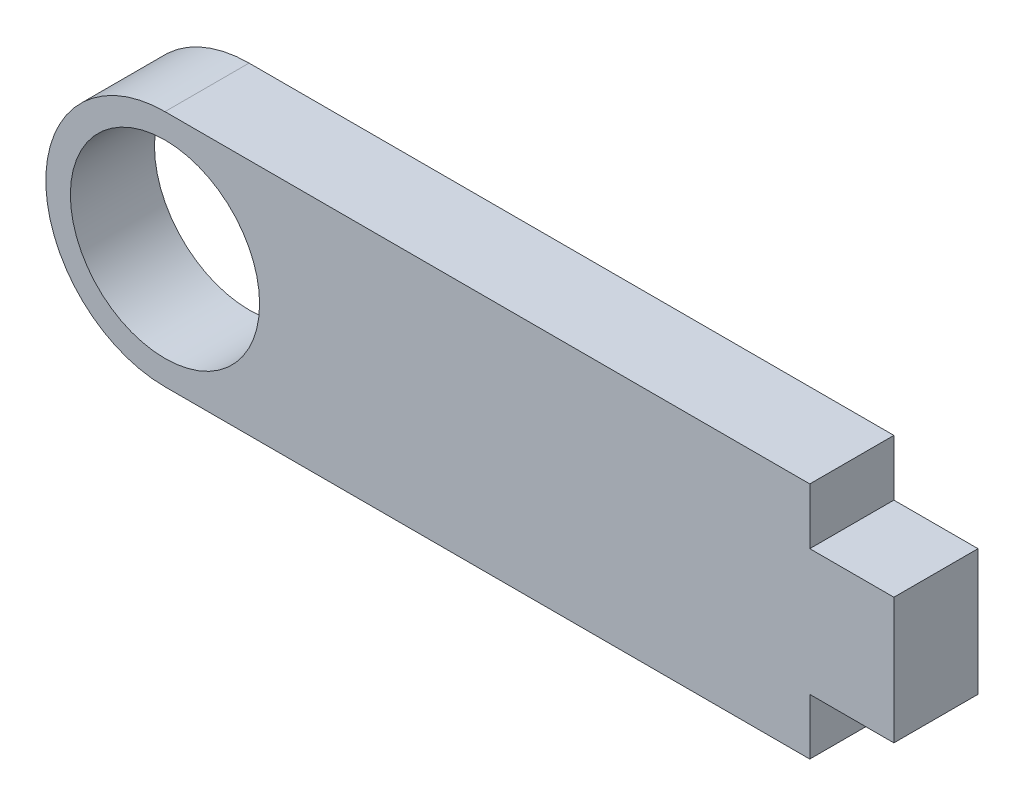
ISO-10303-21;
HEADER;
FILE_DESCRIPTION(('STEP AP214'),'2;1');
FILE_NAME('part.step','',(''),(''),'','','');
FILE_SCHEMA(('AUTOMOTIVE_DESIGN { 1 0 10303 214 1 1 1 1 }'));
ENDSEC;
DATA;
#1=APPLICATION_CONTEXT('core data for automotive mechanical design processes');
#2=APPLICATION_PROTOCOL_DEFINITION('international standard','automotive_design',2000,#1);
#3=PRODUCT_CONTEXT('',#1,'mechanical');
#4=PRODUCT('Part','Part','',(#3));
#5=PRODUCT_RELATED_PRODUCT_CATEGORY('part','',(#4));
#6=PRODUCT_DEFINITION_FORMATION('','',#4);
#7=PRODUCT_DEFINITION_CONTEXT('part definition',#1,'design');
#8=PRODUCT_DEFINITION('design','',#6,#7);
#9=PRODUCT_DEFINITION_SHAPE('','',#8);
#10=(LENGTH_UNIT() NAMED_UNIT(*) SI_UNIT(.MILLI.,.METRE.));
#11=(NAMED_UNIT(*) PLANE_ANGLE_UNIT() SI_UNIT($,.RADIAN.));
#12=(NAMED_UNIT(*) SI_UNIT($,.STERADIAN.) SOLID_ANGLE_UNIT());
#13=UNCERTAINTY_MEASURE_WITH_UNIT(LENGTH_MEASURE(1.E-05),#10,'distance_accuracy_value','');
#14=(GEOMETRIC_REPRESENTATION_CONTEXT(3) GLOBAL_UNCERTAINTY_ASSIGNED_CONTEXT((#13)) GLOBAL_UNIT_ASSIGNED_CONTEXT((#10,
#11,#12)) REPRESENTATION_CONTEXT('',''));
#15=CARTESIAN_POINT('',(0.,0.,0.));
#16=DIRECTION('',(0.,0.,1.));
#17=DIRECTION('',(1.,0.,0.));
#18=AXIS2_PLACEMENT_3D('',#15,#16,#17);
#19=CARTESIAN_POINT('',(-26.,8.5,3.));
#20=DIRECTION('',(0.,0.,1.));
#21=DIRECTION('',(1.,0.,0.));
#22=AXIS2_PLACEMENT_3D('',#19,#20,#21);
#23=PLANE('',#22);
#24=CARTESIAN_POINT('',(-26.,8.5,3.));
#25=DIRECTION('',(0.,0.,1.));
#26=DIRECTION('',(1.,0.,0.));
#27=AXIS2_PLACEMENT_3D('',#24,#25,#26);
#28=CIRCLE('',#27,4.25);
#29=CARTESIAN_POINT('',(-26.,12.75,3.));
#30=VERTEX_POINT('',#29);
#31=CARTESIAN_POINT('',(-26.,4.25,3.));
#32=VERTEX_POINT('',#31);
#33=EDGE_CURVE('E156',#30,#32,#28,.T.);
#34=ORIENTED_EDGE('',*,*,#33,.T.);
#35=DIRECTION('',(1.,0.,0.));
#36=VECTOR('',#35,1.);
#37=CARTESIAN_POINT('',(-26.,4.25,3.));
#38=LINE('',#37,#36);
#39=CARTESIAN_POINT('',(-3.,4.25,3.));
#40=VERTEX_POINT('',#39);
#41=EDGE_CURVE('E104',#32,#40,#38,.T.);
#42=ORIENTED_EDGE('',*,*,#41,.T.);
#43=DIRECTION('',(0.,1.,0.));
#44=VECTOR('',#43,1.);
#45=CARTESIAN_POINT('',(-3.,6.25,3.));
#46=LINE('',#45,#44);
#47=CARTESIAN_POINT('',(-3.,6.25,3.));
#48=VERTEX_POINT('',#47);
#49=EDGE_CURVE('E171',#40,#48,#46,.T.);
#50=ORIENTED_EDGE('',*,*,#49,.T.);
#51=DIRECTION('',(1.,0.,0.));
#52=VECTOR('',#51,1.);
#53=CARTESIAN_POINT('',(0.,6.25,3.));
#54=LINE('',#53,#52);
#55=CARTESIAN_POINT('',(0.,6.25,3.));
#56=VERTEX_POINT('',#55);
#57=EDGE_CURVE('E184',#48,#56,#54,.T.);
#58=ORIENTED_EDGE('',*,*,#57,.T.);
#59=DIRECTION('',(0.,1.,0.));
#60=VECTOR('',#59,1.);
#61=CARTESIAN_POINT('',(0.,10.75,3.));
#62=LINE('',#61,#60);
#63=CARTESIAN_POINT('',(0.,10.75,3.));
#64=VERTEX_POINT('',#63);
#65=EDGE_CURVE('E123',#56,#64,#62,.T.);
#66=ORIENTED_EDGE('',*,*,#65,.T.);
#67=DIRECTION('',(-1.,0.,0.));
#68=VECTOR('',#67,1.);
#69=CARTESIAN_POINT('',(-3.,10.75,3.));
#70=LINE('',#69,#68);
#71=CARTESIAN_POINT('',(-3.,10.75,3.));
#72=VERTEX_POINT('',#71);
#73=EDGE_CURVE('E117',#64,#72,#70,.T.);
#74=ORIENTED_EDGE('',*,*,#73,.T.);
#75=DIRECTION('',(0.,1.,0.));
#76=VECTOR('',#75,1.);
#77=CARTESIAN_POINT('',(-3.,12.75,3.));
#78=LINE('',#77,#76);
#79=CARTESIAN_POINT('',(-3.,12.75,3.));
#80=VERTEX_POINT('',#79);
#81=EDGE_CURVE('E121',#72,#80,#78,.T.);
#82=ORIENTED_EDGE('',*,*,#81,.T.);
#83=DIRECTION('',(-1.,0.,0.));
#84=VECTOR('',#83,1.);
#85=CARTESIAN_POINT('',(-26.,12.75,3.));
#86=LINE('',#85,#84);
#87=EDGE_CURVE('E61',#80,#30,#86,.T.);
#88=ORIENTED_EDGE('',*,*,#87,.T.);
#89=EDGE_LOOP('',(#34,#42,#50,#58,#66,#74,#82,#88));
#90=FACE_BOUND('',#89,.T.);
#91=CARTESIAN_POINT('',(-26.,8.5,3.));
#92=DIRECTION('',(0.,0.,1.));
#93=DIRECTION('',(1.,0.,0.));
#94=AXIS2_PLACEMENT_3D('',#91,#92,#93);
#95=CIRCLE('',#94,3.375);
#96=CARTESIAN_POINT('',(-22.625,8.5,3.));
#97=VERTEX_POINT('',#96);
#98=EDGE_CURVE('E145',#97,#97,#95,.T.);
#99=ORIENTED_EDGE('',*,*,#98,.F.);
#100=EDGE_LOOP('',(#99));
#101=FACE_BOUND('',#100,.T.);
#102=ADVANCED_FACE('F44',(#90,#101),#23,.T.);
#103=CARTESIAN_POINT('',(-26.,8.5,0.));
#104=DIRECTION('',(0.,0.,1.));
#105=DIRECTION('',(1.,0.,0.));
#106=AXIS2_PLACEMENT_3D('',#103,#104,#105);
#107=PLANE('',#106);
#108=CARTESIAN_POINT('',(-26.,8.5,0.));
#109=DIRECTION('',(0.,0.,1.));
#110=DIRECTION('',(1.,0.,0.));
#111=AXIS2_PLACEMENT_3D('',#108,#109,#110);
#112=CIRCLE('',#111,4.25);
#113=CARTESIAN_POINT('',(-26.,12.75,0.));
#114=VERTEX_POINT('',#113);
#115=CARTESIAN_POINT('',(-26.,4.25,0.));
#116=VERTEX_POINT('',#115);
#117=EDGE_CURVE('E141',#114,#116,#112,.T.);
#118=ORIENTED_EDGE('',*,*,#117,.F.);
#119=DIRECTION('',(-1.,0.,0.));
#120=VECTOR('',#119,1.);
#121=CARTESIAN_POINT('',(-26.,12.75,0.));
#122=LINE('',#121,#120);
#123=CARTESIAN_POINT('',(-3.,12.75,0.));
#124=VERTEX_POINT('',#123);
#125=EDGE_CURVE('E96',#124,#114,#122,.T.);
#126=ORIENTED_EDGE('',*,*,#125,.F.);
#127=DIRECTION('',(0.,1.,0.));
#128=VECTOR('',#127,1.);
#129=CARTESIAN_POINT('',(-3.,12.75,0.));
#130=LINE('',#129,#128);
#131=CARTESIAN_POINT('',(-3.,10.75,0.));
#132=VERTEX_POINT('',#131);
#133=EDGE_CURVE('E90',#132,#124,#130,.T.);
#134=ORIENTED_EDGE('',*,*,#133,.F.);
#135=DIRECTION('',(-1.,0.,0.));
#136=VECTOR('',#135,1.);
#137=CARTESIAN_POINT('',(-3.,10.75,0.));
#138=LINE('',#137,#136);
#139=CARTESIAN_POINT('',(0.,10.75,0.));
#140=VERTEX_POINT('',#139);
#141=EDGE_CURVE('E131',#140,#132,#138,.T.);
#142=ORIENTED_EDGE('',*,*,#141,.F.);
#143=DIRECTION('',(0.,1.,0.));
#144=VECTOR('',#143,1.);
#145=CARTESIAN_POINT('',(0.,10.75,0.));
#146=LINE('',#145,#144);
#147=CARTESIAN_POINT('',(0.,6.25,0.));
#148=VERTEX_POINT('',#147);
#149=EDGE_CURVE('E151',#148,#140,#146,.T.);
#150=ORIENTED_EDGE('',*,*,#149,.F.);
#151=DIRECTION('',(1.,0.,0.));
#152=VECTOR('',#151,1.);
#153=CARTESIAN_POINT('',(0.,6.25,0.));
#154=LINE('',#153,#152);
#155=CARTESIAN_POINT('',(-3.,6.25,0.));
#156=VERTEX_POINT('',#155);
#157=EDGE_CURVE('E149',#156,#148,#154,.T.);
#158=ORIENTED_EDGE('',*,*,#157,.F.);
#159=DIRECTION('',(0.,1.,0.));
#160=VECTOR('',#159,1.);
#161=CARTESIAN_POINT('',(-3.,6.25,0.));
#162=LINE('',#161,#160);
#163=CARTESIAN_POINT('',(-3.,4.25,0.));
#164=VERTEX_POINT('',#163);
#165=EDGE_CURVE('E147',#164,#156,#162,.T.);
#166=ORIENTED_EDGE('',*,*,#165,.F.);
#167=DIRECTION('',(1.,0.,0.));
#168=VECTOR('',#167,1.);
#169=CARTESIAN_POINT('',(-26.,4.25,0.));
#170=LINE('',#169,#168);
#171=EDGE_CURVE('E144',#116,#164,#170,.T.);
#172=ORIENTED_EDGE('',*,*,#171,.F.);
#173=EDGE_LOOP('',(#118,#126,#134,#142,#150,#158,#166,#172));
#174=FACE_BOUND('',#173,.T.);
#175=CARTESIAN_POINT('',(-26.,8.5,0.));
#176=DIRECTION('',(0.,0.,1.));
#177=DIRECTION('',(1.,0.,0.));
#178=AXIS2_PLACEMENT_3D('',#175,#176,#177);
#179=CIRCLE('',#178,3.375);
#180=CARTESIAN_POINT('',(-22.625,8.5,0.));
#181=VERTEX_POINT('',#180);
#182=EDGE_CURVE('E190',#181,#181,#179,.T.);
#183=ORIENTED_EDGE('',*,*,#182,.T.);
#184=EDGE_LOOP('',(#183));
#185=FACE_BOUND('',#184,.T.);
#186=ADVANCED_FACE('F175',(#174,#185),#107,.F.);
#187=CARTESIAN_POINT('',(-26.,8.5,3.));
#188=DIRECTION('',(0.,0.,-1.));
#189=DIRECTION('',(-1.,0.,0.));
#190=AXIS2_PLACEMENT_3D('',#187,#188,#189);
#191=CYLINDRICAL_SURFACE('',#190,4.25);
#192=ORIENTED_EDGE('',*,*,#117,.T.);
#193=DIRECTION('',(0.,0.,-1.));
#194=VECTOR('',#193,1.);
#195=CARTESIAN_POINT('',(-26.,4.25,3.));
#196=LINE('',#195,#194);
#197=EDGE_CURVE('E13',#32,#116,#196,.T.);
#198=ORIENTED_EDGE('',*,*,#197,.F.);
#199=ORIENTED_EDGE('',*,*,#33,.F.);
#200=DIRECTION('',(0.,0.,-1.));
#201=VECTOR('',#200,1.);
#202=CARTESIAN_POINT('',(-26.,12.75,3.));
#203=LINE('',#202,#201);
#204=EDGE_CURVE('E137',#30,#114,#203,.T.);
#205=ORIENTED_EDGE('',*,*,#204,.T.);
#206=EDGE_LOOP('',(#192,#198,#199,#205));
#207=FACE_BOUND('',#206,.T.);
#208=ADVANCED_FACE('F46',(#207),#191,.T.);
#209=CARTESIAN_POINT('',(-26.,4.25,3.));
#210=DIRECTION('',(0.,1.,0.));
#211=DIRECTION('',(0.,0.,1.));
#212=AXIS2_PLACEMENT_3D('',#209,#210,#211);
#213=PLANE('',#212);
#214=ORIENTED_EDGE('',*,*,#171,.T.);
#215=DIRECTION('',(0.,0.,-1.));
#216=VECTOR('',#215,1.);
#217=CARTESIAN_POINT('',(-3.,4.25,3.));
#218=LINE('',#217,#216);
#219=EDGE_CURVE('E53',#40,#164,#218,.T.);
#220=ORIENTED_EDGE('',*,*,#219,.F.);
#221=ORIENTED_EDGE('',*,*,#41,.F.);
#222=ORIENTED_EDGE('',*,*,#197,.T.);
#223=EDGE_LOOP('',(#214,#220,#221,#222));
#224=FACE_BOUND('',#223,.T.);
#225=ADVANCED_FACE('F218',(#224),#213,.F.);
#226=CARTESIAN_POINT('',(-3.,6.25,3.));
#227=DIRECTION('',(-1.,0.,0.));
#228=DIRECTION('',(0.,-1.,0.));
#229=AXIS2_PLACEMENT_3D('',#226,#227,#228);
#230=PLANE('',#229);
#231=ORIENTED_EDGE('',*,*,#165,.T.);
#232=DIRECTION('',(0.,0.,-1.));
#233=VECTOR('',#232,1.);
#234=CARTESIAN_POINT('',(-3.,6.25,3.));
#235=LINE('',#234,#233);
#236=EDGE_CURVE('E163',#48,#156,#235,.T.);
#237=ORIENTED_EDGE('',*,*,#236,.F.);
#238=ORIENTED_EDGE('',*,*,#49,.F.);
#239=ORIENTED_EDGE('',*,*,#219,.T.);
#240=EDGE_LOOP('',(#231,#237,#238,#239));
#241=FACE_BOUND('',#240,.T.);
#242=ADVANCED_FACE('F169',(#241),#230,.F.);
#243=CARTESIAN_POINT('',(0.,6.25,3.));
#244=DIRECTION('',(0.,1.,0.));
#245=DIRECTION('',(0.,0.,1.));
#246=AXIS2_PLACEMENT_3D('',#243,#244,#245);
#247=PLANE('',#246);
#248=ORIENTED_EDGE('',*,*,#157,.T.);
#249=DIRECTION('',(0.,0.,-1.));
#250=VECTOR('',#249,1.);
#251=CARTESIAN_POINT('',(0.,6.25,3.));
#252=LINE('',#251,#250);
#253=EDGE_CURVE('E160',#56,#148,#252,.T.);
#254=ORIENTED_EDGE('',*,*,#253,.F.);
#255=ORIENTED_EDGE('',*,*,#57,.F.);
#256=ORIENTED_EDGE('',*,*,#236,.T.);
#257=EDGE_LOOP('',(#248,#254,#255,#256));
#258=FACE_BOUND('',#257,.T.);
#259=ADVANCED_FACE('F180',(#258),#247,.F.);
#260=CARTESIAN_POINT('',(0.,10.75,3.));
#261=DIRECTION('',(-1.,0.,0.));
#262=DIRECTION('',(0.,-1.,0.));
#263=AXIS2_PLACEMENT_3D('',#260,#261,#262);
#264=PLANE('',#263);
#265=ORIENTED_EDGE('',*,*,#149,.T.);
#266=DIRECTION('',(0.,0.,-1.));
#267=VECTOR('',#266,1.);
#268=CARTESIAN_POINT('',(0.,10.75,3.));
#269=LINE('',#268,#267);
#270=EDGE_CURVE('E132',#64,#140,#269,.T.);
#271=ORIENTED_EDGE('',*,*,#270,.F.);
#272=ORIENTED_EDGE('',*,*,#65,.F.);
#273=ORIENTED_EDGE('',*,*,#253,.T.);
#274=EDGE_LOOP('',(#265,#271,#272,#273));
#275=FACE_BOUND('',#274,.T.);
#276=ADVANCED_FACE('F183',(#275),#264,.F.);
#277=CARTESIAN_POINT('',(-3.,10.75,3.));
#278=DIRECTION('',(0.,-1.,0.));
#279=DIRECTION('',(0.,0.,-1.));
#280=AXIS2_PLACEMENT_3D('',#277,#278,#279);
#281=PLANE('',#280);
#282=ORIENTED_EDGE('',*,*,#141,.T.);
#283=DIRECTION('',(0.,0.,-1.));
#284=VECTOR('',#283,1.);
#285=CARTESIAN_POINT('',(-3.,10.75,3.));
#286=LINE('',#285,#284);
#287=EDGE_CURVE('E128',#72,#132,#286,.T.);
#288=ORIENTED_EDGE('',*,*,#287,.F.);
#289=ORIENTED_EDGE('',*,*,#73,.F.);
#290=ORIENTED_EDGE('',*,*,#270,.T.);
#291=EDGE_LOOP('',(#282,#288,#289,#290));
#292=FACE_BOUND('',#291,.T.);
#293=ADVANCED_FACE('F129',(#292),#281,.F.);
#294=CARTESIAN_POINT('',(-3.,12.75,3.));
#295=DIRECTION('',(-1.,0.,0.));
#296=DIRECTION('',(0.,0.,1.));
#297=AXIS2_PLACEMENT_3D('',#294,#295,#296);
#298=PLANE('',#297);
#299=ORIENTED_EDGE('',*,*,#133,.T.);
#300=DIRECTION('',(0.,0.,-1.));
#301=VECTOR('',#300,1.);
#302=CARTESIAN_POINT('',(-3.,12.75,3.));
#303=LINE('',#302,#301);
#304=EDGE_CURVE('E133',#80,#124,#303,.T.);
#305=ORIENTED_EDGE('',*,*,#304,.F.);
#306=ORIENTED_EDGE('',*,*,#81,.F.);
#307=ORIENTED_EDGE('',*,*,#287,.T.);
#308=EDGE_LOOP('',(#299,#305,#306,#307));
#309=FACE_BOUND('',#308,.T.);
#310=ADVANCED_FACE('F135',(#309),#298,.F.);
#311=CARTESIAN_POINT('',(-26.,12.75,3.));
#312=DIRECTION('',(0.,-1.,0.));
#313=DIRECTION('',(0.,0.,-1.));
#314=AXIS2_PLACEMENT_3D('',#311,#312,#313);
#315=PLANE('',#314);
#316=ORIENTED_EDGE('',*,*,#125,.T.);
#317=ORIENTED_EDGE('',*,*,#204,.F.);
#318=ORIENTED_EDGE('',*,*,#87,.F.);
#319=ORIENTED_EDGE('',*,*,#304,.T.);
#320=EDGE_LOOP('',(#316,#317,#318,#319));
#321=FACE_BOUND('',#320,.T.);
#322=ADVANCED_FACE('F206',(#321),#315,.F.);
#323=CARTESIAN_POINT('',(-26.,8.5,3.));
#324=DIRECTION('',(0.,0.,-1.));
#325=DIRECTION('',(-1.,0.,0.));
#326=AXIS2_PLACEMENT_3D('',#323,#324,#325);
#327=CYLINDRICAL_SURFACE('',#326,3.375);
#328=ORIENTED_EDGE('',*,*,#98,.T.);
#329=EDGE_LOOP('',(#328));
#330=FACE_BOUND('',#329,.T.);
#331=ORIENTED_EDGE('',*,*,#182,.F.);
#332=EDGE_LOOP('',(#331));
#333=FACE_BOUND('',#332,.T.);
#334=ADVANCED_FACE('F196',(#330,#333),#327,.F.);
#335=CLOSED_SHELL('',(#102,#186,#208,#225,#242,#259,#276,#293,#310,#322,#334));
#336=MANIFOLD_SOLID_BREP('B2',#335);
#337=ADVANCED_BREP_SHAPE_REPRESENTATION('',(#18,#336),#14);
#338=SHAPE_DEFINITION_REPRESENTATION(#9,#337);
ENDSEC;
END-ISO-10303-21;
